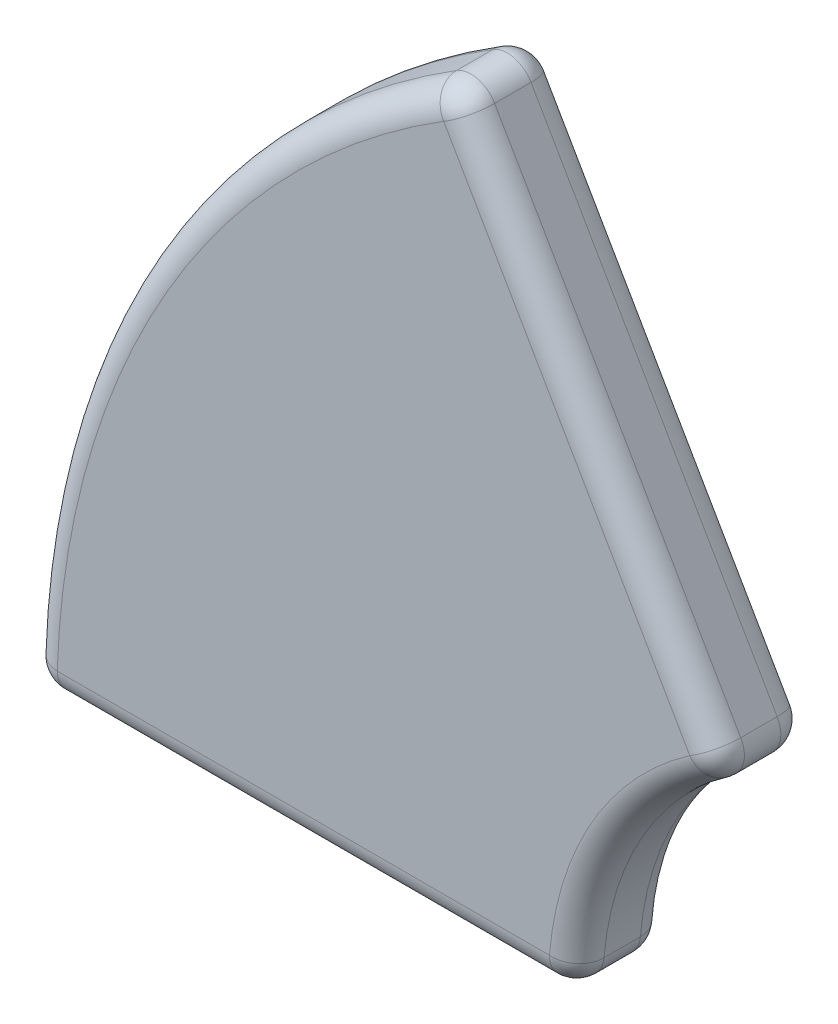
ISO-10303-21;
HEADER;
FILE_DESCRIPTION(('STEP AP214'),'2;1');
FILE_NAME('part.step','',(''),(''),'','','');
FILE_SCHEMA(('AUTOMOTIVE_DESIGN { 1 0 10303 214 1 1 1 1 }'));
ENDSEC;
DATA;
#1=APPLICATION_CONTEXT('core data for automotive mechanical design processes');
#2=APPLICATION_PROTOCOL_DEFINITION('international standard','automotive_design',2000,#1);
#3=PRODUCT_CONTEXT('',#1,'mechanical');
#4=PRODUCT('Part','Part','',(#3));
#5=PRODUCT_RELATED_PRODUCT_CATEGORY('part','',(#4));
#6=PRODUCT_DEFINITION_FORMATION('','',#4);
#7=PRODUCT_DEFINITION_CONTEXT('part definition',#1,'design');
#8=PRODUCT_DEFINITION('design','',#6,#7);
#9=PRODUCT_DEFINITION_SHAPE('','',#8);
#10=(LENGTH_UNIT() NAMED_UNIT(*) SI_UNIT(.MILLI.,.METRE.));
#11=(NAMED_UNIT(*) PLANE_ANGLE_UNIT() SI_UNIT($,.RADIAN.));
#12=(NAMED_UNIT(*) SI_UNIT($,.STERADIAN.) SOLID_ANGLE_UNIT());
#13=UNCERTAINTY_MEASURE_WITH_UNIT(LENGTH_MEASURE(1.E-05),#10,'distance_accuracy_value','');
#14=(GEOMETRIC_REPRESENTATION_CONTEXT(3) GLOBAL_UNCERTAINTY_ASSIGNED_CONTEXT((#13)) GLOBAL_UNIT_ASSIGNED_CONTEXT((#10,
#11,#12)) REPRESENTATION_CONTEXT('',''));
#15=CARTESIAN_POINT('',(0.,0.,0.));
#16=DIRECTION('',(0.,0.,1.));
#17=DIRECTION('',(1.,0.,0.));
#18=AXIS2_PLACEMENT_3D('',#15,#16,#17);
#19=CARTESIAN_POINT('',(0.,0.,100.));
#20=DIRECTION('',(0.,0.,-1.));
#21=DIRECTION('',(-1.,0.,0.));
#22=AXIS2_PLACEMENT_3D('',#19,#20,#21);
#23=CYLINDRICAL_SURFACE('',#22,331.6);
#24=DIRECTION('',(0.,0.,-1.));
#25=VECTOR('',#24,1.);
#26=CARTESIAN_POINT('',(-330.456807269201,27.5110619469027,100.));
#27=LINE('',#26,#25);
#28=CARTESIAN_POINT('',(-330.456807269201,27.5110619469027,70.));
#29=VERTEX_POINT('',#28);
#30=CARTESIAN_POINT('',(-330.456807269201,27.5110619469027,30.));
#31=VERTEX_POINT('',#30);
#32=EDGE_CURVE('E141',#29,#31,#27,.T.);
#33=ORIENTED_EDGE('',*,*,#32,.T.);
#34=CARTESIAN_POINT('',(0.,0.,30.));
#35=DIRECTION('',(0.,0.,1.));
#36=DIRECTION('',(1.,0.,0.));
#37=AXIS2_PLACEMENT_3D('',#34,#35,#36);
#38=CIRCLE('',#37,331.6);
#39=CARTESIAN_POINT('',(-189.053682165705,272.428458975175,30.));
#40=VERTEX_POINT('',#39);
#41=EDGE_CURVE('E136',#31,#40,#38,.F.);
#42=ORIENTED_EDGE('',*,*,#41,.T.);
#43=DIRECTION('',(0.,0.,-1.));
#44=VECTOR('',#43,1.);
#45=CARTESIAN_POINT('',(-189.053682165705,272.428458975175,100.));
#46=LINE('',#45,#44);
#47=CARTESIAN_POINT('',(-189.053682165705,272.428458975175,70.));
#48=VERTEX_POINT('',#47);
#49=EDGE_CURVE('E129',#40,#48,#46,.F.);
#50=ORIENTED_EDGE('',*,*,#49,.T.);
#51=CARTESIAN_POINT('',(0.,0.,70.));
#52=DIRECTION('',(0.,0.,1.));
#53=DIRECTION('',(1.,0.,0.));
#54=AXIS2_PLACEMENT_3D('',#51,#52,#53);
#55=CIRCLE('',#54,331.6);
#56=EDGE_CURVE('E133',#48,#29,#55,.T.);
#57=ORIENTED_EDGE('',*,*,#56,.T.);
#58=EDGE_LOOP('',(#33,#42,#50,#57));
#59=FACE_BOUND('',#58,.T.);
#60=ADVANCED_FACE('F41',(#59),#23,.F.);
#61=CARTESIAN_POINT('',(-165.799999999999,287.17402389492,100.));
#62=DIRECTION('',(-0.86602540378444,-0.499999999999998,0.));
#63=DIRECTION('',(0.499999999999998,-0.86602540378444,0.));
#64=AXIS2_PLACEMENT_3D('',#61,#62,#63);
#65=PLANE('',#64);
#66=DIRECTION('',(-0.499999999999998,0.86602540378444,0.));
#67=VECTOR('',#66,1.);
#68=CARTESIAN_POINT('',(-165.799999999999,287.17402389492,30.));
#69=LINE('',#68,#67);
#70=CARTESIAN_POINT('',(-180.176691056307,312.075183249166,30.));
#71=VERTEX_POINT('',#70);
#72=CARTESIAN_POINT('',(-450.550374542069,780.376140076054,30.));
#73=VERTEX_POINT('',#72);
#74=EDGE_CURVE('E209',#71,#73,#69,.T.);
#75=ORIENTED_EDGE('',*,*,#74,.T.);
#76=DIRECTION('',(0.,0.,-1.));
#77=VECTOR('',#76,1.);
#78=CARTESIAN_POINT('',(-450.550374542069,780.376140076054,100.));
#79=LINE('',#78,#77);
#80=CARTESIAN_POINT('',(-450.550374542069,780.376140076054,70.));
#81=VERTEX_POINT('',#80);
#82=EDGE_CURVE('E212',#73,#81,#79,.F.);
#83=ORIENTED_EDGE('',*,*,#82,.T.);
#84=DIRECTION('',(-0.499999999999998,0.86602540378444,0.));
#85=VECTOR('',#84,1.);
#86=CARTESIAN_POINT('',(-165.799999999999,287.17402389492,70.));
#87=LINE('',#86,#85);
#88=CARTESIAN_POINT('',(-180.176691056307,312.075183249166,70.));
#89=VERTEX_POINT('',#88);
#90=EDGE_CURVE('E206',#81,#89,#87,.F.);
#91=ORIENTED_EDGE('',*,*,#90,.T.);
#92=DIRECTION('',(0.,0.,-1.));
#93=VECTOR('',#92,1.);
#94=CARTESIAN_POINT('',(-180.176691056307,312.075183249166,100.));
#95=LINE('',#94,#93);
#96=EDGE_CURVE('E148',#89,#71,#95,.T.);
#97=ORIENTED_EDGE('',*,*,#96,.T.);
#98=EDGE_LOOP('',(#75,#83,#91,#97));
#99=FACE_BOUND('',#98,.T.);
#100=ADVANCED_FACE('F361',(#99),#65,.F.);
#101=CARTESIAN_POINT('',(0.,0.,100.));
#102=DIRECTION('',(0.,0.,-1.));
#103=DIRECTION('',(-1.,0.,0.));
#104=AXIS2_PLACEMENT_3D('',#101,#102,#103);
#105=CYLINDRICAL_SURFACE('',#104,931.6);
#106=DIRECTION('',(0.,0.,-1.));
#107=VECTOR('',#106,1.);
#108=CARTESIAN_POINT('',(-492.38731910865,790.843402944601,100.));
#109=LINE('',#108,#107);
#110=CARTESIAN_POINT('',(-492.38731910865,790.843402944601,70.));
#111=VERTEX_POINT('',#110);
#112=CARTESIAN_POINT('',(-492.38731910865,790.843402944601,30.));
#113=VERTEX_POINT('',#112);
#114=EDGE_CURVE('E194',#111,#113,#109,.T.);
#115=ORIENTED_EDGE('',*,*,#114,.T.);
#116=CARTESIAN_POINT('',(0.,0.,30.));
#117=DIRECTION('',(0.,0.,1.));
#118=DIRECTION('',(1.,0.,0.));
#119=AXIS2_PLACEMENT_3D('',#116,#117,#118);
#120=CIRCLE('',#119,931.6);
#121=CARTESIAN_POINT('',(-931.084136919682,30.9982253771074,30.));
#122=VERTEX_POINT('',#121);
#123=EDGE_CURVE('E201',#113,#122,#120,.T.);
#124=ORIENTED_EDGE('',*,*,#123,.T.);
#125=DIRECTION('',(0.,0.,-1.));
#126=VECTOR('',#125,1.);
#127=CARTESIAN_POINT('',(-931.084136919682,30.9982253771074,100.));
#128=LINE('',#127,#126);
#129=CARTESIAN_POINT('',(-931.084136919682,30.9982253771074,70.));
#130=VERTEX_POINT('',#129);
#131=EDGE_CURVE('E197',#122,#130,#128,.F.);
#132=ORIENTED_EDGE('',*,*,#131,.T.);
#133=CARTESIAN_POINT('',(0.,0.,70.));
#134=DIRECTION('',(0.,0.,1.));
#135=DIRECTION('',(1.,0.,0.));
#136=AXIS2_PLACEMENT_3D('',#133,#134,#135);
#137=CIRCLE('',#136,931.6);
#138=EDGE_CURVE('E191',#130,#111,#137,.F.);
#139=ORIENTED_EDGE('',*,*,#138,.T.);
#140=EDGE_LOOP('',(#115,#124,#132,#139));
#141=FACE_BOUND('',#140,.T.);
#142=ADVANCED_FACE('F329',(#141),#105,.T.);
#143=CARTESIAN_POINT('',(-331.6,0.,100.));
#144=DIRECTION('',(0.,1.,0.));
#145=DIRECTION('',(-1.,0.,0.));
#146=AXIS2_PLACEMENT_3D('',#143,#144,#145);
#147=PLANE('',#146);
#148=DIRECTION('',(0.,0.,-1.));
#149=VECTOR('',#148,1.);
#150=CARTESIAN_POINT('',(-360.353382112615,0.,100.));
#151=LINE('',#150,#149);
#152=CARTESIAN_POINT('',(-360.353382112615,0.,30.));
#153=VERTEX_POINT('',#152);
#154=CARTESIAN_POINT('',(-360.353382112615,0.,70.));
#155=VERTEX_POINT('',#154);
#156=EDGE_CURVE('E184',#153,#155,#151,.F.);
#157=ORIENTED_EDGE('',*,*,#156,.T.);
#158=DIRECTION('',(1.,0.,0.));
#159=VECTOR('',#158,1.);
#160=CARTESIAN_POINT('',(-931.6,0.,70.));
#161=LINE('',#160,#159);
#162=CARTESIAN_POINT('',(-901.100749084141,0.,70.));
#163=VERTEX_POINT('',#162);
#164=EDGE_CURVE('E188',#155,#163,#161,.F.);
#165=ORIENTED_EDGE('',*,*,#164,.T.);
#166=DIRECTION('',(0.,0.,-1.));
#167=VECTOR('',#166,1.);
#168=CARTESIAN_POINT('',(-901.100749084141,0.,100.));
#169=LINE('',#168,#167);
#170=CARTESIAN_POINT('',(-901.100749084141,0.,30.));
#171=VERTEX_POINT('',#170);
#172=EDGE_CURVE('E181',#163,#171,#169,.T.);
#173=ORIENTED_EDGE('',*,*,#172,.T.);
#174=DIRECTION('',(1.,0.,0.));
#175=VECTOR('',#174,1.);
#176=CARTESIAN_POINT('',(-331.6,0.,30.));
#177=LINE('',#176,#175);
#178=EDGE_CURVE('E178',#171,#153,#177,.T.);
#179=ORIENTED_EDGE('',*,*,#178,.T.);
#180=EDGE_LOOP('',(#157,#165,#173,#179));
#181=FACE_BOUND('',#180,.T.);
#182=ADVANCED_FACE('F351',(#181),#147,.F.);
#183=CARTESIAN_POINT('',(0.,0.,100.));
#184=DIRECTION('',(0.,0.,1.));
#185=DIRECTION('',(1.,0.,0.));
#186=AXIS2_PLACEMENT_3D('',#183,#184,#185);
#187=PLANE('',#186);
#188=CARTESIAN_POINT('',(0.,0.,100.));
#189=DIRECTION('',(0.,0.,1.));
#190=DIRECTION('',(1.,0.,0.));
#191=AXIS2_PLACEMENT_3D('',#188,#189,#190);
#192=CIRCLE('',#191,361.6);
#193=CARTESIAN_POINT('',(-360.353382112615,30.,100.));
#194=VERTEX_POINT('',#193);
#195=CARTESIAN_POINT('',(-206.15745316984,297.075183249166,100.));
#196=VERTEX_POINT('',#195);
#197=EDGE_CURVE('E51',#194,#196,#192,.F.);
#198=ORIENTED_EDGE('',*,*,#197,.T.);
#199=DIRECTION('',(-0.499999999999998,0.86602540378444,0.));
#200=VECTOR('',#199,1.);
#201=CARTESIAN_POINT('',(-491.780762113532,791.789266165584,100.));
#202=LINE('',#201,#200);
#203=CARTESIAN_POINT('',(-476.531136655602,765.376140076054,100.));
#204=VERTEX_POINT('',#203);
#205=EDGE_CURVE('E11',#196,#204,#202,.T.);
#206=ORIENTED_EDGE('',*,*,#205,.T.);
#207=CARTESIAN_POINT('',(0.,0.,100.));
#208=DIRECTION('',(0.,0.,1.));
#209=DIRECTION('',(1.,0.,0.));
#210=AXIS2_PLACEMENT_3D('',#207,#208,#209);
#211=CIRCLE('',#210,901.6);
#212=CARTESIAN_POINT('',(-901.100749084141,30.,100.));
#213=VERTEX_POINT('',#212);
#214=EDGE_CURVE('E229',#204,#213,#211,.T.);
#215=ORIENTED_EDGE('',*,*,#214,.T.);
#216=DIRECTION('',(1.,0.,0.));
#217=VECTOR('',#216,1.);
#218=CARTESIAN_POINT('',(-331.6,30.,100.));
#219=LINE('',#218,#217);
#220=EDGE_CURVE('E62',#213,#194,#219,.T.);
#221=ORIENTED_EDGE('',*,*,#220,.T.);
#222=EDGE_LOOP('',(#198,#206,#215,#221));
#223=FACE_BOUND('',#222,.T.);
#224=ADVANCED_FACE('F349',(#223),#187,.T.);
#225=CARTESIAN_POINT('',(0.,0.,0.));
#226=DIRECTION('',(0.,0.,1.));
#227=DIRECTION('',(1.,0.,0.));
#228=AXIS2_PLACEMENT_3D('',#225,#226,#227);
#229=PLANE('',#228);
#230=CARTESIAN_POINT('',(0.,0.,0.));
#231=DIRECTION('',(0.,0.,1.));
#232=DIRECTION('',(1.,0.,0.));
#233=AXIS2_PLACEMENT_3D('',#230,#231,#232);
#234=CIRCLE('',#233,901.6);
#235=CARTESIAN_POINT('',(-901.100749084141,30.,0.));
#236=VERTEX_POINT('',#235);
#237=CARTESIAN_POINT('',(-476.531136655602,765.376140076054,0.));
#238=VERTEX_POINT('',#237);
#239=EDGE_CURVE('E216',#236,#238,#234,.F.);
#240=ORIENTED_EDGE('',*,*,#239,.T.);
#241=DIRECTION('',(-0.499999999999998,0.86602540378444,0.));
#242=VECTOR('',#241,1.);
#243=CARTESIAN_POINT('',(-25.9807621135332,-15.,0.));
#244=LINE('',#243,#242);
#245=CARTESIAN_POINT('',(-206.15745316984,297.075183249166,0.));
#246=VERTEX_POINT('',#245);
#247=EDGE_CURVE('E225',#238,#246,#244,.F.);
#248=ORIENTED_EDGE('',*,*,#247,.T.);
#249=CARTESIAN_POINT('',(0.,0.,0.));
#250=DIRECTION('',(0.,0.,1.));
#251=DIRECTION('',(1.,0.,0.));
#252=AXIS2_PLACEMENT_3D('',#249,#250,#251);
#253=CIRCLE('',#252,361.6);
#254=CARTESIAN_POINT('',(-360.353382112615,30.,0.));
#255=VERTEX_POINT('',#254);
#256=EDGE_CURVE('E222',#246,#255,#253,.T.);
#257=ORIENTED_EDGE('',*,*,#256,.T.);
#258=DIRECTION('',(1.,0.,0.));
#259=VECTOR('',#258,1.);
#260=CARTESIAN_POINT('',(0.,30.,0.));
#261=LINE('',#260,#259);
#262=EDGE_CURVE('E219',#255,#236,#261,.F.);
#263=ORIENTED_EDGE('',*,*,#262,.T.);
#264=EDGE_LOOP('',(#240,#248,#257,#263));
#265=FACE_BOUND('',#264,.T.);
#266=ADVANCED_FACE('F321',(#265),#229,.F.);
#267=CARTESIAN_POINT('',(-476.531136655602,765.376140076054,100.));
#268=DIRECTION('',(0.,0.,-1.));
#269=DIRECTION('',(-1.,0.,0.));
#270=AXIS2_PLACEMENT_3D('',#267,#268,#269);
#271=CYLINDRICAL_SURFACE('',#270,30.);
#272=CARTESIAN_POINT('',(-476.531136655602,765.376140076054,70.));
#273=DIRECTION('',(0.,0.,1.));
#274=DIRECTION('',(1.,0.,0.));
#275=AXIS2_PLACEMENT_3D('',#272,#273,#274);
#276=CIRCLE('',#275,30.);
#277=EDGE_CURVE('E45',#81,#111,#276,.T.);
#278=ORIENTED_EDGE('',*,*,#277,.F.);
#279=ORIENTED_EDGE('',*,*,#82,.F.);
#280=CARTESIAN_POINT('',(-476.531136655602,765.376140076054,30.));
#281=DIRECTION('',(0.,0.,-1.));
#282=DIRECTION('',(-1.,0.,0.));
#283=AXIS2_PLACEMENT_3D('',#280,#281,#282);
#284=CIRCLE('',#283,30.);
#285=EDGE_CURVE('E172',#113,#73,#284,.T.);
#286=ORIENTED_EDGE('',*,*,#285,.F.);
#287=ORIENTED_EDGE('',*,*,#114,.F.);
#288=EDGE_LOOP('',(#278,#279,#286,#287));
#289=FACE_BOUND('',#288,.T.);
#290=ADVANCED_FACE('F43',(#289),#271,.T.);
#291=CARTESIAN_POINT('',(-476.531136655602,765.376140076054,70.));
#292=DIRECTION('',(0.,0.,1.));
#293=DIRECTION('',(1.,0.,0.));
#294=AXIS2_PLACEMENT_3D('',#291,#292,#293);
#295=SPHERICAL_SURFACE('',#294,30.);
#296=CARTESIAN_POINT('',(-476.531136655602,765.376140076054,70.));
#297=DIRECTION('',(-0.500000000000003,0.866025403784437,0.));
#298=DIRECTION('',(-0.866025403784437,-0.500000000000003,0.));
#299=AXIS2_PLACEMENT_3D('',#296,#297,#298);
#300=CIRCLE('',#299,30.);
#301=EDGE_CURVE('E297',#81,#204,#300,.F.);
#302=ORIENTED_EDGE('',*,*,#301,.F.);
#303=ORIENTED_EDGE('',*,*,#277,.T.);
#304=CARTESIAN_POINT('',(-476.531136655602,765.376140076054,70.));
#305=DIRECTION('',(0.848908762284887,0.528539415101599,0.));
#306=DIRECTION('',(-0.5285394151016,0.848908762284887,0.));
#307=AXIS2_PLACEMENT_3D('',#304,#305,#306);
#308=CIRCLE('',#307,30.);
#309=EDGE_CURVE('E301',#204,#111,#308,.F.);
#310=ORIENTED_EDGE('',*,*,#309,.F.);
#311=EDGE_LOOP('',(#302,#303,#310));
#312=FACE_BOUND('',#311,.T.);
#313=ADVANCED_FACE('F346',(#312),#295,.T.);
#314=CARTESIAN_POINT('',(-476.531136655602,765.376140076054,30.));
#315=DIRECTION('',(0.,0.,1.));
#316=DIRECTION('',(1.,0.,0.));
#317=AXIS2_PLACEMENT_3D('',#314,#315,#316);
#318=SPHERICAL_SURFACE('',#317,30.);
#319=CARTESIAN_POINT('',(-476.531136655602,765.376140076054,30.));
#320=DIRECTION('',(0.848908762284886,0.528539415101602,0.));
#321=DIRECTION('',(-0.528539415101602,0.848908762284886,0.));
#322=AXIS2_PLACEMENT_3D('',#319,#320,#321);
#323=CIRCLE('',#322,30.);
#324=EDGE_CURVE('E289',#113,#238,#323,.F.);
#325=ORIENTED_EDGE('',*,*,#324,.F.);
#326=ORIENTED_EDGE('',*,*,#285,.T.);
#327=CARTESIAN_POINT('',(-476.531136655602,765.376140076054,30.));
#328=DIRECTION('',(-0.499999999999997,0.86602540378444,0.));
#329=DIRECTION('',(-0.86602540378444,-0.499999999999997,0.));
#330=AXIS2_PLACEMENT_3D('',#327,#328,#329);
#331=CIRCLE('',#330,30.);
#332=EDGE_CURVE('E293',#238,#73,#331,.F.);
#333=ORIENTED_EDGE('',*,*,#332,.F.);
#334=EDGE_LOOP('',(#325,#326,#333));
#335=FACE_BOUND('',#334,.T.);
#336=ADVANCED_FACE('F310',(#335),#318,.T.);
#337=CARTESIAN_POINT('',(0.,0.,70.));
#338=DIRECTION('',(0.,0.,1.));
#339=DIRECTION('',(1.,0.,0.));
#340=AXIS2_PLACEMENT_3D('',#337,#338,#339);
#341=TOROIDAL_SURFACE('',#340,901.6,30.);
#342=ORIENTED_EDGE('',*,*,#309,.T.);
#343=ORIENTED_EDGE('',*,*,#138,.F.);
#344=CARTESIAN_POINT('',(-901.100749084141,30.,70.));
#345=DIRECTION('',(-0.0332741792369122,-0.999446261184717,0.));
#346=DIRECTION('',(0.999446261184717,-0.0332741792369122,0.));
#347=AXIS2_PLACEMENT_3D('',#344,#345,#346);
#348=CIRCLE('',#347,30.);
#349=EDGE_CURVE('E282',#213,#130,#348,.T.);
#350=ORIENTED_EDGE('',*,*,#349,.F.);
#351=ORIENTED_EDGE('',*,*,#214,.F.);
#352=EDGE_LOOP('',(#342,#343,#350,#351));
#353=FACE_BOUND('',#352,.T.);
#354=ADVANCED_FACE('F341',(#353),#341,.T.);
#355=CARTESIAN_POINT('',(-25.9807621135332,-15.,70.));
#356=DIRECTION('',(0.499999999999998,-0.86602540378444,0.));
#357=DIRECTION('',(0.86602540378444,0.499999999999998,0.));
#358=AXIS2_PLACEMENT_3D('',#355,#356,#357);
#359=CYLINDRICAL_SURFACE('',#358,30.);
#360=ORIENTED_EDGE('',*,*,#301,.T.);
#361=ORIENTED_EDGE('',*,*,#205,.F.);
#362=CARTESIAN_POINT('',(-206.15745316984,297.075183249166,70.));
#363=DIRECTION('',(0.499999999999998,-0.86602540378444,0.));
#364=DIRECTION('',(0.86602540378444,0.499999999999998,0.));
#365=AXIS2_PLACEMENT_3D('',#362,#363,#364);
#366=CIRCLE('',#365,30.);
#367=EDGE_CURVE('E153',#89,#196,#366,.T.);
#368=ORIENTED_EDGE('',*,*,#367,.F.);
#369=ORIENTED_EDGE('',*,*,#90,.F.);
#370=EDGE_LOOP('',(#360,#361,#368,#369));
#371=FACE_BOUND('',#370,.T.);
#372=ADVANCED_FACE('F348',(#371),#359,.T.);
#373=CARTESIAN_POINT('',(-206.15745316984,297.075183249166,100.));
#374=DIRECTION('',(0.,0.,-1.));
#375=DIRECTION('',(-1.,0.,0.));
#376=AXIS2_PLACEMENT_3D('',#373,#374,#375);
#377=CYLINDRICAL_SURFACE('',#376,30.);
#378=CARTESIAN_POINT('',(-206.15745316984,297.075183249166,30.));
#379=DIRECTION('',(0.,0.,-1.));
#380=DIRECTION('',(-1.,0.,0.));
#381=AXIS2_PLACEMENT_3D('',#378,#379,#380);
#382=CIRCLE('',#381,30.);
#383=EDGE_CURVE('E154',#71,#40,#382,.T.);
#384=ORIENTED_EDGE('',*,*,#383,.F.);
#385=ORIENTED_EDGE('',*,*,#96,.F.);
#386=CARTESIAN_POINT('',(-206.15745316984,297.075183249166,70.));
#387=DIRECTION('',(0.,0.,1.));
#388=DIRECTION('',(1.,0.,0.));
#389=AXIS2_PLACEMENT_3D('',#386,#387,#388);
#390=CIRCLE('',#389,30.);
#391=EDGE_CURVE('E145',#48,#89,#390,.T.);
#392=ORIENTED_EDGE('',*,*,#391,.F.);
#393=ORIENTED_EDGE('',*,*,#49,.F.);
#394=EDGE_LOOP('',(#384,#385,#392,#393));
#395=FACE_BOUND('',#394,.T.);
#396=ADVANCED_FACE('F147',(#395),#377,.T.);
#397=CARTESIAN_POINT('',(-191.780762113533,272.17402389492,30.));
#398=DIRECTION('',(-0.499999999999998,0.86602540378444,0.));
#399=DIRECTION('',(-0.86602540378444,-0.499999999999998,0.));
#400=AXIS2_PLACEMENT_3D('',#397,#398,#399);
#401=CYLINDRICAL_SURFACE('',#400,30.);
#402=ORIENTED_EDGE('',*,*,#332,.T.);
#403=ORIENTED_EDGE('',*,*,#74,.F.);
#404=CARTESIAN_POINT('',(-206.15745316984,297.075183249166,30.));
#405=DIRECTION('',(0.499999999999998,-0.86602540378444,0.));
#406=DIRECTION('',(0.86602540378444,0.499999999999998,0.));
#407=AXIS2_PLACEMENT_3D('',#404,#405,#406);
#408=CIRCLE('',#407,30.);
#409=EDGE_CURVE('E274',#246,#71,#408,.T.);
#410=ORIENTED_EDGE('',*,*,#409,.F.);
#411=ORIENTED_EDGE('',*,*,#247,.F.);
#412=EDGE_LOOP('',(#402,#403,#410,#411));
#413=FACE_BOUND('',#412,.T.);
#414=ADVANCED_FACE('F318',(#413),#401,.T.);
#415=CARTESIAN_POINT('',(0.,0.,30.));
#416=DIRECTION('',(0.,0.,1.));
#417=DIRECTION('',(1.,0.,0.));
#418=AXIS2_PLACEMENT_3D('',#415,#416,#417);
#419=TOROIDAL_SURFACE('',#418,901.6,30.);
#420=ORIENTED_EDGE('',*,*,#324,.T.);
#421=ORIENTED_EDGE('',*,*,#239,.F.);
#422=CARTESIAN_POINT('',(-901.100749084141,30.,30.));
#423=DIRECTION('',(-0.0332741792369121,-0.999446261184717,0.));
#424=DIRECTION('',(0.999446261184717,-0.0332741792369121,0.));
#425=AXIS2_PLACEMENT_3D('',#422,#423,#424);
#426=CIRCLE('',#425,30.);
#427=EDGE_CURVE('E270',#122,#236,#426,.T.);
#428=ORIENTED_EDGE('',*,*,#427,.F.);
#429=ORIENTED_EDGE('',*,*,#123,.F.);
#430=EDGE_LOOP('',(#420,#421,#428,#429));
#431=FACE_BOUND('',#430,.T.);
#432=ADVANCED_FACE('F326',(#431),#419,.T.);
#433=CARTESIAN_POINT('',(-901.100749084141,30.,100.));
#434=DIRECTION('',(0.,0.,-1.));
#435=DIRECTION('',(-1.,0.,0.));
#436=AXIS2_PLACEMENT_3D('',#433,#434,#435);
#437=CYLINDRICAL_SURFACE('',#436,30.);
#438=CARTESIAN_POINT('',(-901.100749084141,30.,70.));
#439=DIRECTION('',(0.,0.,1.));
#440=DIRECTION('',(1.,0.,0.));
#441=AXIS2_PLACEMENT_3D('',#438,#439,#440);
#442=CIRCLE('',#441,30.);
#443=EDGE_CURVE('E285',#130,#163,#442,.T.);
#444=ORIENTED_EDGE('',*,*,#443,.F.);
#445=ORIENTED_EDGE('',*,*,#131,.F.);
#446=CARTESIAN_POINT('',(-901.100749084141,30.,30.));
#447=DIRECTION('',(0.,0.,-1.));
#448=DIRECTION('',(-1.,0.,0.));
#449=AXIS2_PLACEMENT_3D('',#446,#447,#448);
#450=CIRCLE('',#449,30.);
#451=EDGE_CURVE('E266',#171,#122,#450,.T.);
#452=ORIENTED_EDGE('',*,*,#451,.F.);
#453=ORIENTED_EDGE('',*,*,#172,.F.);
#454=EDGE_LOOP('',(#444,#445,#452,#453));
#455=FACE_BOUND('',#454,.T.);
#456=ADVANCED_FACE('F333',(#455),#437,.T.);
#457=CARTESIAN_POINT('',(-901.100749084141,30.,70.));
#458=DIRECTION('',(0.,0.,1.));
#459=DIRECTION('',(1.,0.,0.));
#460=AXIS2_PLACEMENT_3D('',#457,#458,#459);
#461=SPHERICAL_SURFACE('',#460,30.);
#462=ORIENTED_EDGE('',*,*,#349,.T.);
#463=ORIENTED_EDGE('',*,*,#443,.T.);
#464=CARTESIAN_POINT('',(-901.100749084141,30.,70.));
#465=DIRECTION('',(-1.,0.,0.));
#466=DIRECTION('',(0.,0.,1.));
#467=AXIS2_PLACEMENT_3D('',#464,#465,#466);
#468=CIRCLE('',#467,30.);
#469=EDGE_CURVE('E161',#213,#163,#468,.F.);
#470=ORIENTED_EDGE('',*,*,#469,.F.);
#471=EDGE_LOOP('',(#462,#463,#470));
#472=FACE_BOUND('',#471,.T.);
#473=ADVANCED_FACE('F406',(#472),#461,.T.);
#474=CARTESIAN_POINT('',(-206.15745316984,297.075183249166,70.));
#475=DIRECTION('',(0.,0.,1.));
#476=DIRECTION('',(1.,0.,0.));
#477=AXIS2_PLACEMENT_3D('',#474,#475,#476);
#478=SPHERICAL_SURFACE('',#477,30.);
#479=ORIENTED_EDGE('',*,*,#391,.T.);
#480=ORIENTED_EDGE('',*,*,#367,.T.);
#481=CARTESIAN_POINT('',(-206.15745316984,297.075183249166,70.));
#482=DIRECTION('',(0.821557475799682,0.570125700137833,0.));
#483=DIRECTION('',(-0.570125700137833,0.821557475799682,0.));
#484=AXIS2_PLACEMENT_3D('',#481,#482,#483);
#485=CIRCLE('',#484,30.);
#486=EDGE_CURVE('E157',#48,#196,#485,.F.);
#487=ORIENTED_EDGE('',*,*,#486,.F.);
#488=EDGE_LOOP('',(#479,#480,#487));
#489=FACE_BOUND('',#488,.T.);
#490=ADVANCED_FACE('F158',(#489),#478,.T.);
#491=CARTESIAN_POINT('',(-206.15745316984,297.075183249166,30.));
#492=DIRECTION('',(0.,0.,1.));
#493=DIRECTION('',(1.,0.,0.));
#494=AXIS2_PLACEMENT_3D('',#491,#492,#493);
#495=SPHERICAL_SURFACE('',#494,30.);
#496=ORIENTED_EDGE('',*,*,#409,.T.);
#497=ORIENTED_EDGE('',*,*,#383,.T.);
#498=CARTESIAN_POINT('',(-206.15745316984,297.075183249166,30.));
#499=DIRECTION('',(0.821557475799684,0.570125700137831,0.));
#500=DIRECTION('',(-0.570125700137831,0.821557475799684,0.));
#501=AXIS2_PLACEMENT_3D('',#498,#499,#500);
#502=CIRCLE('',#501,30.);
#503=EDGE_CURVE('E162',#246,#40,#502,.F.);
#504=ORIENTED_EDGE('',*,*,#503,.F.);
#505=EDGE_LOOP('',(#496,#497,#504));
#506=FACE_BOUND('',#505,.T.);
#507=ADVANCED_FACE('F399',(#506),#495,.T.);
#508=CARTESIAN_POINT('',(-901.100749084141,30.,30.));
#509=DIRECTION('',(0.,0.,1.));
#510=DIRECTION('',(1.,0.,0.));
#511=AXIS2_PLACEMENT_3D('',#508,#509,#510);
#512=SPHERICAL_SURFACE('',#511,30.);
#513=ORIENTED_EDGE('',*,*,#451,.T.);
#514=ORIENTED_EDGE('',*,*,#427,.T.);
#515=CARTESIAN_POINT('',(-901.100749084141,30.,30.));
#516=DIRECTION('',(-1.,0.,0.));
#517=DIRECTION('',(0.,0.,1.));
#518=AXIS2_PLACEMENT_3D('',#515,#516,#517);
#519=CIRCLE('',#518,30.);
#520=EDGE_CURVE('E256',#171,#236,#519,.F.);
#521=ORIENTED_EDGE('',*,*,#520,.F.);
#522=EDGE_LOOP('',(#513,#514,#521));
#523=FACE_BOUND('',#522,.T.);
#524=ADVANCED_FACE('F395',(#523),#512,.T.);
#525=CARTESIAN_POINT('',(0.,30.,70.));
#526=DIRECTION('',(-1.,0.,0.));
#527=DIRECTION('',(0.,-1.,0.));
#528=AXIS2_PLACEMENT_3D('',#525,#526,#527);
#529=CYLINDRICAL_SURFACE('',#528,30.);
#530=ORIENTED_EDGE('',*,*,#469,.T.);
#531=ORIENTED_EDGE('',*,*,#164,.F.);
#532=CARTESIAN_POINT('',(-360.353382112615,30.,70.));
#533=DIRECTION('',(1.,0.,0.));
#534=DIRECTION('',(0.,0.,-1.));
#535=AXIS2_PLACEMENT_3D('',#532,#533,#534);
#536=CIRCLE('',#535,30.);
#537=EDGE_CURVE('E252',#194,#155,#536,.T.);
#538=ORIENTED_EDGE('',*,*,#537,.F.);
#539=ORIENTED_EDGE('',*,*,#220,.F.);
#540=EDGE_LOOP('',(#530,#531,#538,#539));
#541=FACE_BOUND('',#540,.T.);
#542=ADVANCED_FACE('F392',(#541),#529,.T.);
#543=CARTESIAN_POINT('',(0.,0.,70.));
#544=DIRECTION('',(0.,0.,1.));
#545=DIRECTION('',(1.,0.,0.));
#546=AXIS2_PLACEMENT_3D('',#543,#544,#545);
#547=TOROIDAL_SURFACE('',#546,361.6,30.);
#548=ORIENTED_EDGE('',*,*,#486,.T.);
#549=ORIENTED_EDGE('',*,*,#197,.F.);
#550=CARTESIAN_POINT('',(-360.353382112615,30.,70.));
#551=DIRECTION('',(-0.0829646017699115,-0.996552494780461,0.));
#552=DIRECTION('',(0.996552494780461,-0.0829646017699115,0.));
#553=AXIS2_PLACEMENT_3D('',#550,#551,#552);
#554=CIRCLE('',#553,30.);
#555=EDGE_CURVE('E166',#29,#194,#554,.T.);
#556=ORIENTED_EDGE('',*,*,#555,.F.);
#557=ORIENTED_EDGE('',*,*,#56,.F.);
#558=EDGE_LOOP('',(#548,#549,#556,#557));
#559=FACE_BOUND('',#558,.T.);
#560=ADVANCED_FACE('F164',(#559),#547,.T.);
#561=CARTESIAN_POINT('',(0.,0.,30.));
#562=DIRECTION('',(0.,0.,1.));
#563=DIRECTION('',(1.,0.,0.));
#564=AXIS2_PLACEMENT_3D('',#561,#562,#563);
#565=TOROIDAL_SURFACE('',#564,361.6,30.);
#566=ORIENTED_EDGE('',*,*,#503,.T.);
#567=ORIENTED_EDGE('',*,*,#41,.F.);
#568=CARTESIAN_POINT('',(-360.353382112615,30.,30.));
#569=DIRECTION('',(-0.0829646017699116,-0.996552494780461,0.));
#570=DIRECTION('',(0.996552494780461,-0.0829646017699116,0.));
#571=AXIS2_PLACEMENT_3D('',#568,#569,#570);
#572=CIRCLE('',#571,30.);
#573=EDGE_CURVE('E246',#255,#31,#572,.T.);
#574=ORIENTED_EDGE('',*,*,#573,.F.);
#575=ORIENTED_EDGE('',*,*,#256,.F.);
#576=EDGE_LOOP('',(#566,#567,#574,#575));
#577=FACE_BOUND('',#576,.T.);
#578=ADVANCED_FACE('F385',(#577),#565,.T.);
#579=CARTESIAN_POINT('',(-331.6,30.,30.));
#580=DIRECTION('',(1.,0.,0.));
#581=DIRECTION('',(0.,1.,0.));
#582=AXIS2_PLACEMENT_3D('',#579,#580,#581);
#583=CYLINDRICAL_SURFACE('',#582,30.);
#584=ORIENTED_EDGE('',*,*,#520,.T.);
#585=ORIENTED_EDGE('',*,*,#262,.F.);
#586=CARTESIAN_POINT('',(-360.353382112615,30.,30.));
#587=DIRECTION('',(1.,0.,0.));
#588=DIRECTION('',(0.,0.,-1.));
#589=AXIS2_PLACEMENT_3D('',#586,#587,#588);
#590=CIRCLE('',#589,30.);
#591=EDGE_CURVE('E242',#153,#255,#590,.T.);
#592=ORIENTED_EDGE('',*,*,#591,.F.);
#593=ORIENTED_EDGE('',*,*,#178,.F.);
#594=EDGE_LOOP('',(#584,#585,#592,#593));
#595=FACE_BOUND('',#594,.T.);
#596=ADVANCED_FACE('F381',(#595),#583,.T.);
#597=CARTESIAN_POINT('',(-360.353382112615,30.,70.));
#598=DIRECTION('',(0.,0.,1.));
#599=DIRECTION('',(1.,0.,0.));
#600=AXIS2_PLACEMENT_3D('',#597,#598,#599);
#601=SPHERICAL_SURFACE('',#600,30.);
#602=ORIENTED_EDGE('',*,*,#555,.T.);
#603=ORIENTED_EDGE('',*,*,#537,.T.);
#604=CARTESIAN_POINT('',(-360.353382112615,30.,70.));
#605=DIRECTION('',(0.,0.,1.));
#606=DIRECTION('',(1.,0.,0.));
#607=AXIS2_PLACEMENT_3D('',#604,#605,#606);
#608=CIRCLE('',#607,30.);
#609=EDGE_CURVE('E239',#29,#155,#608,.F.);
#610=ORIENTED_EDGE('',*,*,#609,.F.);
#611=EDGE_LOOP('',(#602,#603,#610));
#612=FACE_BOUND('',#611,.T.);
#613=ADVANCED_FACE('F377',(#612),#601,.T.);
#614=CARTESIAN_POINT('',(-360.353382112615,30.,30.));
#615=DIRECTION('',(0.,0.,1.));
#616=DIRECTION('',(1.,0.,0.));
#617=AXIS2_PLACEMENT_3D('',#614,#615,#616);
#618=SPHERICAL_SURFACE('',#617,30.);
#619=ORIENTED_EDGE('',*,*,#591,.T.);
#620=ORIENTED_EDGE('',*,*,#573,.T.);
#621=CARTESIAN_POINT('',(-360.353382112615,30.,30.));
#622=DIRECTION('',(0.,0.,-1.));
#623=DIRECTION('',(-1.,0.,0.));
#624=AXIS2_PLACEMENT_3D('',#621,#622,#623);
#625=CIRCLE('',#624,30.);
#626=EDGE_CURVE('E236',#153,#31,#625,.F.);
#627=ORIENTED_EDGE('',*,*,#626,.F.);
#628=EDGE_LOOP('',(#619,#620,#627));
#629=FACE_BOUND('',#628,.T.);
#630=ADVANCED_FACE('F373',(#629),#618,.T.);
#631=CARTESIAN_POINT('',(-360.353382112615,30.,100.));
#632=DIRECTION('',(0.,0.,-1.));
#633=DIRECTION('',(-1.,0.,0.));
#634=AXIS2_PLACEMENT_3D('',#631,#632,#633);
#635=CYLINDRICAL_SURFACE('',#634,30.);
#636=ORIENTED_EDGE('',*,*,#609,.T.);
#637=ORIENTED_EDGE('',*,*,#156,.F.);
#638=ORIENTED_EDGE('',*,*,#626,.T.);
#639=ORIENTED_EDGE('',*,*,#32,.F.);
#640=EDGE_LOOP('',(#636,#637,#638,#639));
#641=FACE_BOUND('',#640,.T.);
#642=ADVANCED_FACE('F370',(#641),#635,.T.);
#643=CLOSED_SHELL('',(#60,#100,#142,#182,#224,#266,#290,#313,#336,#354,#372,#396,#414,#432,#456,
#473,#490,#507,#524,#542,#560,#578,#596,#613,#630,#642));
#644=MANIFOLD_SOLID_BREP('B2',#643);
#645=ADVANCED_BREP_SHAPE_REPRESENTATION('',(#18,#644),#14);
#646=SHAPE_DEFINITION_REPRESENTATION(#9,#645);
ENDSEC;
END-ISO-10303-21;
